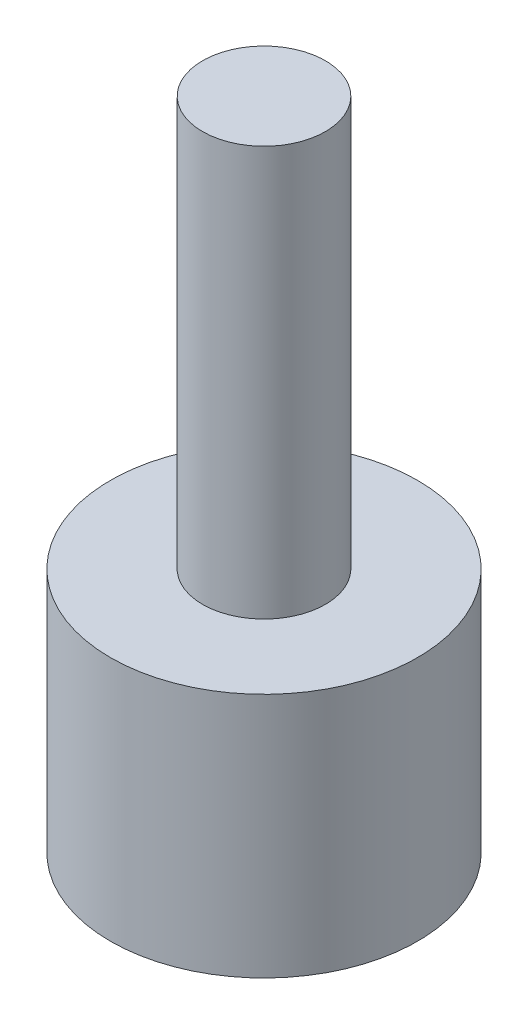
ISO-10303-21;
HEADER;
FILE_DESCRIPTION(('STEP AP214'),'2;1');
FILE_NAME('part.step','',(''),(''),'','','');
FILE_SCHEMA(('AUTOMOTIVE_DESIGN { 1 0 10303 214 1 1 1 1 }'));
ENDSEC;
DATA;
#1=APPLICATION_CONTEXT('core data for automotive mechanical design processes');
#2=APPLICATION_PROTOCOL_DEFINITION('international standard','automotive_design',2000,#1);
#3=PRODUCT_CONTEXT('',#1,'mechanical');
#4=PRODUCT('Part','Part','',(#3));
#5=PRODUCT_RELATED_PRODUCT_CATEGORY('part','',(#4));
#6=PRODUCT_DEFINITION_FORMATION('','',#4);
#7=PRODUCT_DEFINITION_CONTEXT('part definition',#1,'design');
#8=PRODUCT_DEFINITION('design','',#6,#7);
#9=PRODUCT_DEFINITION_SHAPE('','',#8);
#10=(LENGTH_UNIT() NAMED_UNIT(*) SI_UNIT(.MILLI.,.METRE.));
#11=(NAMED_UNIT(*) PLANE_ANGLE_UNIT() SI_UNIT($,.RADIAN.));
#12=(NAMED_UNIT(*) SI_UNIT($,.STERADIAN.) SOLID_ANGLE_UNIT());
#13=UNCERTAINTY_MEASURE_WITH_UNIT(LENGTH_MEASURE(1.E-05),#10,'distance_accuracy_value','');
#14=(GEOMETRIC_REPRESENTATION_CONTEXT(3) GLOBAL_UNCERTAINTY_ASSIGNED_CONTEXT((#13)) GLOBAL_UNIT_ASSIGNED_CONTEXT((#10,
#11,#12)) REPRESENTATION_CONTEXT('',''));
#15=CARTESIAN_POINT('',(0.,0.,0.));
#16=DIRECTION('',(0.,0.,1.));
#17=DIRECTION('',(1.,0.,0.));
#18=AXIS2_PLACEMENT_3D('',#15,#16,#17);
#19=CARTESIAN_POINT('',(0.,6.,0.));
#20=DIRECTION('',(0.,1.,0.));
#21=DIRECTION('',(0.,0.,1.));
#22=AXIS2_PLACEMENT_3D('',#19,#20,#21);
#23=PLANE('',#22);
#24=CARTESIAN_POINT('',(0.,6.,0.));
#25=DIRECTION('',(0.,1.,0.));
#26=DIRECTION('',(0.,0.,1.));
#27=AXIS2_PLACEMENT_3D('',#24,#25,#26);
#28=CIRCLE('',#27,3.75);
#29=CARTESIAN_POINT('',(0.,6.,3.75));
#30=VERTEX_POINT('',#29);
#31=EDGE_CURVE('E10',#30,#30,#28,.T.);
#32=ORIENTED_EDGE('',*,*,#31,.T.);
#33=EDGE_LOOP('',(#32));
#34=FACE_BOUND('',#33,.T.);
#35=CARTESIAN_POINT('',(0.,6.,0.));
#36=DIRECTION('',(0.,1.,0.));
#37=DIRECTION('',(0.,0.,1.));
#38=AXIS2_PLACEMENT_3D('',#35,#36,#37);
#39=CIRCLE('',#38,1.5);
#40=CARTESIAN_POINT('',(0.,6.,1.5));
#41=VERTEX_POINT('',#40);
#42=EDGE_CURVE('E46',#41,#41,#39,.T.);
#43=ORIENTED_EDGE('',*,*,#42,.F.);
#44=EDGE_LOOP('',(#43));
#45=FACE_BOUND('',#44,.T.);
#46=ADVANCED_FACE('F33',(#34,#45),#23,.T.);
#47=CARTESIAN_POINT('',(0.,6.,0.));
#48=DIRECTION('',(0.,-1.,0.));
#49=DIRECTION('',(0.,0.,-1.));
#50=AXIS2_PLACEMENT_3D('',#47,#48,#49);
#51=CYLINDRICAL_SURFACE('',#50,3.75);
#52=ORIENTED_EDGE('',*,*,#31,.F.);
#53=EDGE_LOOP('',(#52));
#54=FACE_BOUND('',#53,.T.);
#55=CARTESIAN_POINT('',(0.,0.,0.));
#56=DIRECTION('',(0.,1.,0.));
#57=DIRECTION('',(0.,0.,1.));
#58=AXIS2_PLACEMENT_3D('',#55,#56,#57);
#59=CIRCLE('',#58,3.75);
#60=CARTESIAN_POINT('',(0.,0.,3.75));
#61=VERTEX_POINT('',#60);
#62=EDGE_CURVE('E37',#61,#61,#59,.T.);
#63=ORIENTED_EDGE('',*,*,#62,.T.);
#64=EDGE_LOOP('',(#63));
#65=FACE_BOUND('',#64,.T.);
#66=ADVANCED_FACE('F35',(#54,#65),#51,.T.);
#67=CARTESIAN_POINT('',(0.,0.,0.));
#68=DIRECTION('',(0.,1.,0.));
#69=DIRECTION('',(0.,0.,1.));
#70=AXIS2_PLACEMENT_3D('',#67,#68,#69);
#71=PLANE('',#70);
#72=ORIENTED_EDGE('',*,*,#62,.F.);
#73=EDGE_LOOP('',(#72));
#74=FACE_BOUND('',#73,.T.);
#75=ADVANCED_FACE('F57',(#74),#71,.F.);
#76=CARTESIAN_POINT('',(0.,16.,0.));
#77=DIRECTION('',(0.,-1.,0.));
#78=DIRECTION('',(0.,0.,-1.));
#79=AXIS2_PLACEMENT_3D('',#76,#77,#78);
#80=CYLINDRICAL_SURFACE('',#79,1.5);
#81=CARTESIAN_POINT('',(0.,16.,0.));
#82=DIRECTION('',(0.,1.,0.));
#83=DIRECTION('',(0.,0.,1.));
#84=AXIS2_PLACEMENT_3D('',#81,#82,#83);
#85=CIRCLE('',#84,1.5);
#86=CARTESIAN_POINT('',(0.,16.,1.5));
#87=VERTEX_POINT('',#86);
#88=EDGE_CURVE('E44',#87,#87,#85,.T.);
#89=ORIENTED_EDGE('',*,*,#88,.F.);
#90=EDGE_LOOP('',(#89));
#91=FACE_BOUND('',#90,.T.);
#92=ORIENTED_EDGE('',*,*,#42,.T.);
#93=EDGE_LOOP('',(#92));
#94=FACE_BOUND('',#93,.T.);
#95=ADVANCED_FACE('F54',(#91,#94),#80,.T.);
#96=CARTESIAN_POINT('',(0.,16.,0.));
#97=DIRECTION('',(0.,1.,0.));
#98=DIRECTION('',(0.,0.,1.));
#99=AXIS2_PLACEMENT_3D('',#96,#97,#98);
#100=PLANE('',#99);
#101=ORIENTED_EDGE('',*,*,#88,.T.);
#102=EDGE_LOOP('',(#101));
#103=FACE_BOUND('',#102,.T.);
#104=ADVANCED_FACE('F52',(#103),#100,.T.);
#105=CLOSED_SHELL('',(#46,#66,#75,#95,#104));
#106=MANIFOLD_SOLID_BREP('B2',#105);
#107=ADVANCED_BREP_SHAPE_REPRESENTATION('',(#18,#106),#14);
#108=SHAPE_DEFINITION_REPRESENTATION(#9,#107);
ENDSEC;
END-ISO-10303-21;
